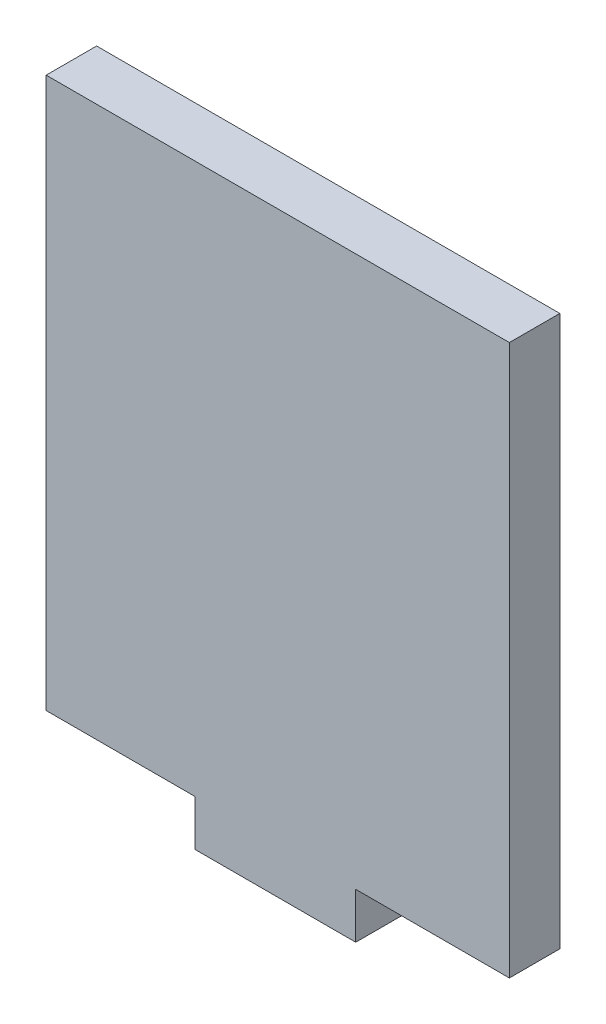
ISO-10303-21;
HEADER;
FILE_DESCRIPTION(('STEP AP214'),'2;1');
FILE_NAME('part.step','',(''),(''),'','','');
FILE_SCHEMA(('AUTOMOTIVE_DESIGN { 1 0 10303 214 1 1 1 1 }'));
ENDSEC;
DATA;
#1=APPLICATION_CONTEXT('core data for automotive mechanical design processes');
#2=APPLICATION_PROTOCOL_DEFINITION('international standard','automotive_design',2000,#1);
#3=PRODUCT_CONTEXT('',#1,'mechanical');
#4=PRODUCT('Part','Part','',(#3));
#5=PRODUCT_RELATED_PRODUCT_CATEGORY('part','',(#4));
#6=PRODUCT_DEFINITION_FORMATION('','',#4);
#7=PRODUCT_DEFINITION_CONTEXT('part definition',#1,'design');
#8=PRODUCT_DEFINITION('design','',#6,#7);
#9=PRODUCT_DEFINITION_SHAPE('','',#8);
#10=(LENGTH_UNIT() NAMED_UNIT(*) SI_UNIT(.MILLI.,.METRE.));
#11=(NAMED_UNIT(*) PLANE_ANGLE_UNIT() SI_UNIT($,.RADIAN.));
#12=(NAMED_UNIT(*) SI_UNIT($,.STERADIAN.) SOLID_ANGLE_UNIT());
#13=UNCERTAINTY_MEASURE_WITH_UNIT(LENGTH_MEASURE(1.E-05),#10,'distance_accuracy_value','');
#14=(GEOMETRIC_REPRESENTATION_CONTEXT(3) GLOBAL_UNCERTAINTY_ASSIGNED_CONTEXT((#13)) GLOBAL_UNIT_ASSIGNED_CONTEXT((#10,
#11,#12)) REPRESENTATION_CONTEXT('',''));
#15=CARTESIAN_POINT('',(0.,0.,0.));
#16=DIRECTION('',(0.,0.,1.));
#17=DIRECTION('',(1.,0.,0.));
#18=AXIS2_PLACEMENT_3D('',#15,#16,#17);
#19=CARTESIAN_POINT('',(0.,0.,0.));
#20=DIRECTION('',(0.,0.,-1.));
#21=DIRECTION('',(-1.,0.,0.));
#22=AXIS2_PLACEMENT_3D('',#19,#20,#21);
#23=PLANE('',#22);
#24=DIRECTION('',(0.,1.,0.));
#25=VECTOR('',#24,1.);
#26=CARTESIAN_POINT('',(7.63480656632229,0.,0.));
#27=LINE('',#26,#25);
#28=CARTESIAN_POINT('',(7.63480656632229,16.0005302352066,0.));
#29=VERTEX_POINT('',#28);
#30=CARTESIAN_POINT('',(7.63480656632229,35.0505302352066,0.));
#31=VERTEX_POINT('',#30);
#32=EDGE_CURVE('E11',#29,#31,#27,.T.);
#33=ORIENTED_EDGE('',*,*,#32,.F.);
#34=DIRECTION('',(-1.,0.,0.));
#35=VECTOR('',#34,1.);
#36=CARTESIAN_POINT('',(12.7148065663223,16.0005302352066,0.));
#37=LINE('',#36,#35);
#38=CARTESIAN_POINT('',(12.7148065663223,16.0005302352066,0.));
#39=VERTEX_POINT('',#38);
#40=EDGE_CURVE('E168',#39,#29,#37,.T.);
#41=ORIENTED_EDGE('',*,*,#40,.F.);
#42=DIRECTION('',(0.,1.,0.));
#43=VECTOR('',#42,1.);
#44=CARTESIAN_POINT('',(12.7148065663223,0.,0.));
#45=LINE('',#44,#43);
#46=CARTESIAN_POINT('',(12.7148065663223,35.0505302352066,0.));
#47=VERTEX_POINT('',#46);
#48=EDGE_CURVE('E41',#39,#47,#45,.T.);
#49=ORIENTED_EDGE('',*,*,#48,.T.);
#50=DIRECTION('',(-1.,0.,0.));
#51=VECTOR('',#50,1.);
#52=CARTESIAN_POINT('',(12.7148065663223,35.0505302352066,0.));
#53=LINE('',#52,#51);
#54=EDGE_CURVE('E151',#47,#31,#53,.T.);
#55=ORIENTED_EDGE('',*,*,#54,.T.);
#56=EDGE_LOOP('',(#33,#41,#49,#55));
#57=FACE_BOUND('',#56,.T.);
#58=DIRECTION('',(0.,1.,0.));
#59=VECTOR('',#58,1.);
#60=CARTESIAN_POINT('',(13.5784065663224,56.0055302352066,0.));
#61=LINE('',#60,#59);
#62=CARTESIAN_POINT('',(13.5784065663224,-4.95446976479338,0.));
#63=VERTEX_POINT('',#62);
#64=CARTESIAN_POINT('',(13.5784065663224,56.0055302352066,0.));
#65=VERTEX_POINT('',#64);
#66=EDGE_CURVE('E235',#63,#65,#61,.T.);
#67=ORIENTED_EDGE('',*,*,#66,.F.);
#68=DIRECTION('',(1.,0.,0.));
#69=VECTOR('',#68,1.);
#70=CARTESIAN_POINT('',(13.5784065663224,-4.95446976479338,0.));
#71=LINE('',#70,#69);
#72=CARTESIAN_POINT('',(-3.43959343367763,-4.95446976479338,0.));
#73=VERTEX_POINT('',#72);
#74=EDGE_CURVE('E233',#73,#63,#71,.T.);
#75=ORIENTED_EDGE('',*,*,#74,.F.);
#76=DIRECTION('',(0.,1.,0.));
#77=VECTOR('',#76,1.);
#78=CARTESIAN_POINT('',(-3.43959343367763,-4.95446976479338,0.));
#79=LINE('',#78,#77);
#80=CARTESIAN_POINT('',(-3.43959343367763,-10.0344697647934,0.));
#81=VERTEX_POINT('',#80);
#82=EDGE_CURVE('E231',#81,#73,#79,.T.);
#83=ORIENTED_EDGE('',*,*,#82,.F.);
#84=DIRECTION('',(1.,0.,0.));
#85=VECTOR('',#84,1.);
#86=CARTESIAN_POINT('',(-3.43959343367763,-10.0344697647934,0.));
#87=LINE('',#86,#85);
#88=CARTESIAN_POINT('',(-21.2195934336776,-10.0344697647934,0.));
#89=VERTEX_POINT('',#88);
#90=EDGE_CURVE('E229',#89,#81,#87,.T.);
#91=ORIENTED_EDGE('',*,*,#90,.F.);
#92=DIRECTION('',(0.,-1.,0.));
#93=VECTOR('',#92,1.);
#94=CARTESIAN_POINT('',(-21.2195934336776,-4.95446976479339,0.));
#95=LINE('',#94,#93);
#96=CARTESIAN_POINT('',(-21.2195934336776,-4.95446976479339,0.));
#97=VERTEX_POINT('',#96);
#98=EDGE_CURVE('E227',#97,#89,#95,.T.);
#99=ORIENTED_EDGE('',*,*,#98,.F.);
#100=DIRECTION('',(1.,0.,0.));
#101=VECTOR('',#100,1.);
#102=CARTESIAN_POINT('',(-21.2195934336776,-4.95446976479339,0.));
#103=LINE('',#102,#101);
#104=CARTESIAN_POINT('',(-37.7295934336776,-4.95446976479339,0.));
#105=VERTEX_POINT('',#104);
#106=EDGE_CURVE('E225',#105,#97,#103,.T.);
#107=ORIENTED_EDGE('',*,*,#106,.F.);
#108=DIRECTION('',(0.,-1.,0.));
#109=VECTOR('',#108,1.);
#110=CARTESIAN_POINT('',(-37.7295934336776,56.0055302352066,0.));
#111=LINE('',#110,#109);
#112=CARTESIAN_POINT('',(-37.7295934336772,16.0005302352066,1.2490009027033E-13));
#113=VERTEX_POINT('',#112);
#114=EDGE_CURVE('E202',#113,#105,#111,.T.);
#115=ORIENTED_EDGE('',*,*,#114,.F.);
#116=DIRECTION('',(-1.,0.,0.));
#117=VECTOR('',#116,1.);
#118=CARTESIAN_POINT('',(-32.6495934336772,16.0005302352066,-2.35922392732846E-13));
#119=LINE('',#118,#117);
#120=CARTESIAN_POINT('',(-32.6495934336768,16.0005302352066,0.));
#121=VERTEX_POINT('',#120);
#122=EDGE_CURVE('E186',#121,#113,#119,.T.);
#123=ORIENTED_EDGE('',*,*,#122,.F.);
#124=DIRECTION('',(0.,-1.,0.));
#125=VECTOR('',#124,1.);
#126=CARTESIAN_POINT('',(-32.6495934336772,0.,0.));
#127=LINE('',#126,#125);
#128=CARTESIAN_POINT('',(-32.6495934336772,35.0505302352066,-2.63677968348475E-13));
#129=VERTEX_POINT('',#128);
#130=EDGE_CURVE('E261',#129,#121,#127,.T.);
#131=ORIENTED_EDGE('',*,*,#130,.F.);
#132=DIRECTION('',(-1.,0.,0.));
#133=VECTOR('',#132,1.);
#134=CARTESIAN_POINT('',(-32.6495934336772,35.0505302352066,-2.63677968348475E-13));
#135=LINE('',#134,#133);
#136=CARTESIAN_POINT('',(-37.7295934336772,35.0505302352066,0.));
#137=VERTEX_POINT('',#136);
#138=EDGE_CURVE('E199',#129,#137,#135,.T.);
#139=ORIENTED_EDGE('',*,*,#138,.T.);
#140=CARTESIAN_POINT('',(-37.7295934336776,56.0055302352066,0.));
#141=VERTEX_POINT('',#140);
#142=EDGE_CURVE('E222',#141,#137,#111,.T.);
#143=ORIENTED_EDGE('',*,*,#142,.F.);
#144=DIRECTION('',(-1.,0.,0.));
#145=VECTOR('',#144,1.);
#146=CARTESIAN_POINT('',(-37.7295934336776,56.0055302352066,0.));
#147=LINE('',#146,#145);
#148=EDGE_CURVE('E207',#65,#141,#147,.T.);
#149=ORIENTED_EDGE('',*,*,#148,.F.);
#150=EDGE_LOOP('',(#67,#75,#83,#91,#99,#107,#115,#123,#131,#139,#143,#149));
#151=FACE_BOUND('',#150,.T.);
#152=ADVANCED_FACE('F33',(#57,#151),#23,.T.);
#153=CARTESIAN_POINT('',(-37.7295934336776,56.0055302352066,5.588));
#154=DIRECTION('',(1.,0.,0.));
#155=DIRECTION('',(0.,1.,0.));
#156=AXIS2_PLACEMENT_3D('',#153,#154,#155);
#157=PLANE('',#156);
#158=DIRECTION('',(0.,0.,1.));
#159=VECTOR('',#158,1.);
#160=CARTESIAN_POINT('',(-37.7295934336772,35.0505302352066,0.));
#161=LINE('',#160,#159);
#162=CARTESIAN_POINT('',(-37.7295934336768,35.0505302352068,5.08000000001468));
#163=VERTEX_POINT('',#162);
#164=EDGE_CURVE('E179',#137,#163,#161,.T.);
#165=ORIENTED_EDGE('',*,*,#164,.T.);
#166=DIRECTION('',(0.,-1.,0.));
#167=VECTOR('',#166,1.);
#168=CARTESIAN_POINT('',(-37.7295934336768,16.0005302352068,5.08000000001471));
#169=LINE('',#168,#167);
#170=CARTESIAN_POINT('',(-37.7295934336768,16.0005302352068,5.08000000001471));
#171=VERTEX_POINT('',#170);
#172=EDGE_CURVE('E189',#163,#171,#169,.T.);
#173=ORIENTED_EDGE('',*,*,#172,.T.);
#174=DIRECTION('',(0.,0.,-1.));
#175=VECTOR('',#174,1.);
#176=CARTESIAN_POINT('',(-37.7295934336772,16.0005302352066,1.2490009027033E-13));
#177=LINE('',#176,#175);
#178=EDGE_CURVE('E183',#171,#113,#177,.T.);
#179=ORIENTED_EDGE('',*,*,#178,.T.);
#180=ORIENTED_EDGE('',*,*,#114,.T.);
#181=DIRECTION('',(0.,0.,-1.));
#182=VECTOR('',#181,1.);
#183=CARTESIAN_POINT('',(-37.7295934336776,-4.95446976479339,5.588));
#184=LINE('',#183,#182);
#185=CARTESIAN_POINT('',(-37.7295934336776,-4.95446976479339,5.588));
#186=VERTEX_POINT('',#185);
#187=EDGE_CURVE('E258',#186,#105,#184,.T.);
#188=ORIENTED_EDGE('',*,*,#187,.F.);
#189=DIRECTION('',(0.,-1.,0.));
#190=VECTOR('',#189,1.);
#191=CARTESIAN_POINT('',(-37.7295934336776,56.0055302352066,5.588));
#192=LINE('',#191,#190);
#193=CARTESIAN_POINT('',(-37.7295934336776,56.0055302352066,5.588));
#194=VERTEX_POINT('',#193);
#195=EDGE_CURVE('E203',#194,#186,#192,.T.);
#196=ORIENTED_EDGE('',*,*,#195,.F.);
#197=DIRECTION('',(0.,0.,-1.));
#198=VECTOR('',#197,1.);
#199=CARTESIAN_POINT('',(-37.7295934336776,56.0055302352066,5.588));
#200=LINE('',#199,#198);
#201=EDGE_CURVE('E221',#194,#141,#200,.T.);
#202=ORIENTED_EDGE('',*,*,#201,.T.);
#203=ORIENTED_EDGE('',*,*,#142,.T.);
#204=EDGE_LOOP('',(#165,#173,#179,#180,#188,#196,#202,#203));
#205=FACE_BOUND('',#204,.T.);
#206=ADVANCED_FACE('F35',(#205),#157,.F.);
#207=CARTESIAN_POINT('',(-21.2195934336776,-4.95446976479339,5.588));
#208=DIRECTION('',(0.,1.,0.));
#209=DIRECTION('',(-1.,0.,0.));
#210=AXIS2_PLACEMENT_3D('',#207,#208,#209);
#211=PLANE('',#210);
#212=ORIENTED_EDGE('',*,*,#106,.T.);
#213=DIRECTION('',(0.,0.,-1.));
#214=VECTOR('',#213,1.);
#215=CARTESIAN_POINT('',(-21.2195934336776,-4.95446976479339,5.588));
#216=LINE('',#215,#214);
#217=CARTESIAN_POINT('',(-21.2195934336776,-4.95446976479339,5.588));
#218=VERTEX_POINT('',#217);
#219=EDGE_CURVE('E255',#218,#97,#216,.T.);
#220=ORIENTED_EDGE('',*,*,#219,.F.);
#221=DIRECTION('',(1.,0.,0.));
#222=VECTOR('',#221,1.);
#223=CARTESIAN_POINT('',(-21.2195934336776,-4.95446976479339,5.588));
#224=LINE('',#223,#222);
#225=EDGE_CURVE('E206',#186,#218,#224,.T.);
#226=ORIENTED_EDGE('',*,*,#225,.F.);
#227=ORIENTED_EDGE('',*,*,#187,.T.);
#228=EDGE_LOOP('',(#212,#220,#226,#227));
#229=FACE_BOUND('',#228,.T.);
#230=ADVANCED_FACE('F288',(#229),#211,.F.);
#231=CARTESIAN_POINT('',(-21.2195934336776,-4.95446976479339,5.588));
#232=DIRECTION('',(1.,0.,0.));
#233=DIRECTION('',(0.,0.,-1.));
#234=AXIS2_PLACEMENT_3D('',#231,#232,#233);
#235=PLANE('',#234);
#236=ORIENTED_EDGE('',*,*,#98,.T.);
#237=DIRECTION('',(0.,0.,-1.));
#238=VECTOR('',#237,1.);
#239=CARTESIAN_POINT('',(-21.2195934336776,-10.0344697647934,5.588));
#240=LINE('',#239,#238);
#241=CARTESIAN_POINT('',(-21.2195934336776,-10.0344697647934,5.588));
#242=VERTEX_POINT('',#241);
#243=EDGE_CURVE('E252',#242,#89,#240,.T.);
#244=ORIENTED_EDGE('',*,*,#243,.F.);
#245=DIRECTION('',(0.,-1.,0.));
#246=VECTOR('',#245,1.);
#247=CARTESIAN_POINT('',(-21.2195934336776,-4.95446976479339,5.588));
#248=LINE('',#247,#246);
#249=EDGE_CURVE('E209',#218,#242,#248,.T.);
#250=ORIENTED_EDGE('',*,*,#249,.F.);
#251=ORIENTED_EDGE('',*,*,#219,.T.);
#252=EDGE_LOOP('',(#236,#244,#250,#251));
#253=FACE_BOUND('',#252,.T.);
#254=ADVANCED_FACE('F313',(#253),#235,.F.);
#255=CARTESIAN_POINT('',(-3.43959343367763,-10.0344697647934,5.588));
#256=DIRECTION('',(0.,1.,0.));
#257=DIRECTION('',(-1.,0.,0.));
#258=AXIS2_PLACEMENT_3D('',#255,#256,#257);
#259=PLANE('',#258);
#260=ORIENTED_EDGE('',*,*,#90,.T.);
#261=DIRECTION('',(0.,0.,-1.));
#262=VECTOR('',#261,1.);
#263=CARTESIAN_POINT('',(-3.43959343367763,-10.0344697647934,5.588));
#264=LINE('',#263,#262);
#265=CARTESIAN_POINT('',(-3.43959343367763,-10.0344697647934,5.588));
#266=VERTEX_POINT('',#265);
#267=EDGE_CURVE('E249',#266,#81,#264,.T.);
#268=ORIENTED_EDGE('',*,*,#267,.F.);
#269=DIRECTION('',(1.,0.,0.));
#270=VECTOR('',#269,1.);
#271=CARTESIAN_POINT('',(-3.43959343367763,-10.0344697647934,5.588));
#272=LINE('',#271,#270);
#273=EDGE_CURVE('E211',#242,#266,#272,.T.);
#274=ORIENTED_EDGE('',*,*,#273,.F.);
#275=ORIENTED_EDGE('',*,*,#243,.T.);
#276=EDGE_LOOP('',(#260,#268,#274,#275));
#277=FACE_BOUND('',#276,.T.);
#278=ADVANCED_FACE('F309',(#277),#259,.F.);
#279=CARTESIAN_POINT('',(-3.43959343367763,-4.95446976479338,5.588));
#280=DIRECTION('',(-1.,0.,0.));
#281=DIRECTION('',(0.,-1.,0.));
#282=AXIS2_PLACEMENT_3D('',#279,#280,#281);
#283=PLANE('',#282);
#284=ORIENTED_EDGE('',*,*,#82,.T.);
#285=DIRECTION('',(0.,0.,-1.));
#286=VECTOR('',#285,1.);
#287=CARTESIAN_POINT('',(-3.43959343367763,-4.95446976479338,5.588));
#288=LINE('',#287,#286);
#289=CARTESIAN_POINT('',(-3.43959343367763,-4.95446976479338,5.588));
#290=VERTEX_POINT('',#289);
#291=EDGE_CURVE('E246',#290,#73,#288,.T.);
#292=ORIENTED_EDGE('',*,*,#291,.F.);
#293=DIRECTION('',(0.,1.,0.));
#294=VECTOR('',#293,1.);
#295=CARTESIAN_POINT('',(-3.43959343367763,-4.95446976479338,5.588));
#296=LINE('',#295,#294);
#297=EDGE_CURVE('E213',#266,#290,#296,.T.);
#298=ORIENTED_EDGE('',*,*,#297,.F.);
#299=ORIENTED_EDGE('',*,*,#267,.T.);
#300=EDGE_LOOP('',(#284,#292,#298,#299));
#301=FACE_BOUND('',#300,.T.);
#302=ADVANCED_FACE('F305',(#301),#283,.F.);
#303=CARTESIAN_POINT('',(13.5784065663224,-4.95446976479338,5.588));
#304=DIRECTION('',(0.,1.,0.));
#305=DIRECTION('',(-1.,0.,0.));
#306=AXIS2_PLACEMENT_3D('',#303,#304,#305);
#307=PLANE('',#306);
#308=ORIENTED_EDGE('',*,*,#74,.T.);
#309=DIRECTION('',(0.,0.,-1.));
#310=VECTOR('',#309,1.);
#311=CARTESIAN_POINT('',(13.5784065663224,-4.95446976479338,5.588));
#312=LINE('',#311,#310);
#313=CARTESIAN_POINT('',(13.5784065663224,-4.95446976479338,5.588));
#314=VERTEX_POINT('',#313);
#315=EDGE_CURVE('E243',#314,#63,#312,.T.);
#316=ORIENTED_EDGE('',*,*,#315,.F.);
#317=DIRECTION('',(1.,0.,0.));
#318=VECTOR('',#317,1.);
#319=CARTESIAN_POINT('',(13.5784065663224,-4.95446976479338,5.588));
#320=LINE('',#319,#318);
#321=EDGE_CURVE('E215',#290,#314,#320,.T.);
#322=ORIENTED_EDGE('',*,*,#321,.F.);
#323=ORIENTED_EDGE('',*,*,#291,.T.);
#324=EDGE_LOOP('',(#308,#316,#322,#323));
#325=FACE_BOUND('',#324,.T.);
#326=ADVANCED_FACE('F301',(#325),#307,.F.);
#327=CARTESIAN_POINT('',(13.5784065663224,56.0055302352066,5.588));
#328=DIRECTION('',(-1.,0.,0.));
#329=DIRECTION('',(0.,0.,1.));
#330=AXIS2_PLACEMENT_3D('',#327,#328,#329);
#331=PLANE('',#330);
#332=ORIENTED_EDGE('',*,*,#66,.T.);
#333=DIRECTION('',(0.,0.,-1.));
#334=VECTOR('',#333,1.);
#335=CARTESIAN_POINT('',(13.5784065663224,56.0055302352066,5.588));
#336=LINE('',#335,#334);
#337=CARTESIAN_POINT('',(13.5784065663224,56.0055302352066,5.588));
#338=VERTEX_POINT('',#337);
#339=EDGE_CURVE('E240',#338,#65,#336,.T.);
#340=ORIENTED_EDGE('',*,*,#339,.F.);
#341=DIRECTION('',(0.,1.,0.));
#342=VECTOR('',#341,1.);
#343=CARTESIAN_POINT('',(13.5784065663224,56.0055302352066,5.588));
#344=LINE('',#343,#342);
#345=EDGE_CURVE('E217',#314,#338,#344,.T.);
#346=ORIENTED_EDGE('',*,*,#345,.F.);
#347=ORIENTED_EDGE('',*,*,#315,.T.);
#348=EDGE_LOOP('',(#332,#340,#346,#347));
#349=FACE_BOUND('',#348,.T.);
#350=ADVANCED_FACE('F297',(#349),#331,.F.);
#351=CARTESIAN_POINT('',(-37.7295934336776,56.0055302352066,5.588));
#352=DIRECTION('',(0.,-1.,0.));
#353=DIRECTION('',(1.,0.,0.));
#354=AXIS2_PLACEMENT_3D('',#351,#352,#353);
#355=PLANE('',#354);
#356=ORIENTED_EDGE('',*,*,#148,.T.);
#357=ORIENTED_EDGE('',*,*,#201,.F.);
#358=DIRECTION('',(-1.,0.,0.));
#359=VECTOR('',#358,1.);
#360=CARTESIAN_POINT('',(-37.7295934336776,56.0055302352066,5.588));
#361=LINE('',#360,#359);
#362=EDGE_CURVE('E219',#338,#194,#361,.T.);
#363=ORIENTED_EDGE('',*,*,#362,.F.);
#364=ORIENTED_EDGE('',*,*,#339,.T.);
#365=EDGE_LOOP('',(#356,#357,#363,#364));
#366=FACE_BOUND('',#365,.T.);
#367=ADVANCED_FACE('F294',(#366),#355,.F.);
#368=CARTESIAN_POINT('',(0.,0.,5.588));
#369=DIRECTION('',(0.,0.,-1.));
#370=DIRECTION('',(-1.,0.,0.));
#371=AXIS2_PLACEMENT_3D('',#368,#369,#370);
#372=PLANE('',#371);
#373=ORIENTED_EDGE('',*,*,#195,.T.);
#374=ORIENTED_EDGE('',*,*,#225,.T.);
#375=ORIENTED_EDGE('',*,*,#249,.T.);
#376=ORIENTED_EDGE('',*,*,#273,.T.);
#377=ORIENTED_EDGE('',*,*,#297,.T.);
#378=ORIENTED_EDGE('',*,*,#321,.T.);
#379=ORIENTED_EDGE('',*,*,#345,.T.);
#380=ORIENTED_EDGE('',*,*,#362,.T.);
#381=EDGE_LOOP('',(#373,#374,#375,#376,#377,#378,#379,#380));
#382=FACE_BOUND('',#381,.T.);
#383=ADVANCED_FACE('F292',(#382),#372,.F.);
#384=CARTESIAN_POINT('',(-32.649593433685,-47.3538049191325,-109.219999999986));
#385=DIRECTION('',(1.,0.,0.));
#386=DIRECTION('',(0.,0.,1.));
#387=AXIS2_PLACEMENT_3D('',#384,#385,#386);
#388=PLANE('',#387);
#389=ORIENTED_EDGE('',*,*,#130,.T.);
#390=DIRECTION('',(0.,0.,-1.));
#391=VECTOR('',#390,1.);
#392=CARTESIAN_POINT('',(-32.6495934336772,16.0005302352066,-2.35922392732846E-13));
#393=LINE('',#392,#391);
#394=CARTESIAN_POINT('',(-32.6495934336768,16.0005302352068,5.08000000001435));
#395=VERTEX_POINT('',#394);
#396=EDGE_CURVE('E56',#395,#121,#393,.T.);
#397=ORIENTED_EDGE('',*,*,#396,.F.);
#398=DIRECTION('',(0.,-1.,0.));
#399=VECTOR('',#398,1.);
#400=CARTESIAN_POINT('',(-32.6495934336768,16.0005302352068,5.08000000001435));
#401=LINE('',#400,#399);
#402=CARTESIAN_POINT('',(-32.6495934336768,35.0505302352068,5.08000000001432));
#403=VERTEX_POINT('',#402);
#404=EDGE_CURVE('E182',#403,#395,#401,.T.);
#405=ORIENTED_EDGE('',*,*,#404,.F.);
#406=DIRECTION('',(0.,0.,1.));
#407=VECTOR('',#406,1.);
#408=CARTESIAN_POINT('',(-32.6495934336772,35.0505302352066,-2.63677968348475E-13));
#409=LINE('',#408,#407);
#410=EDGE_CURVE('E180',#129,#403,#409,.T.);
#411=ORIENTED_EDGE('',*,*,#410,.F.);
#412=EDGE_LOOP('',(#389,#397,#405,#411));
#413=FACE_BOUND('',#412,.T.);
#414=ADVANCED_FACE('F351',(#413),#388,.F.);
#415=CARTESIAN_POINT('',(-32.6495934336772,35.0505302352066,-2.63677968348475E-13));
#416=DIRECTION('',(0.,-1.,0.));
#417=DIRECTION('',(0.,0.,-1.));
#418=AXIS2_PLACEMENT_3D('',#415,#416,#417);
#419=PLANE('',#418);
#420=ORIENTED_EDGE('',*,*,#164,.F.);
#421=ORIENTED_EDGE('',*,*,#138,.F.);
#422=ORIENTED_EDGE('',*,*,#410,.T.);
#423=DIRECTION('',(-1.,0.,0.));
#424=VECTOR('',#423,1.);
#425=CARTESIAN_POINT('',(-32.6495934336768,35.0505302352068,5.08000000001432));
#426=LINE('',#425,#424);
#427=EDGE_CURVE('E197',#403,#163,#426,.T.);
#428=ORIENTED_EDGE('',*,*,#427,.T.);
#429=EDGE_LOOP('',(#420,#421,#422,#428));
#430=FACE_BOUND('',#429,.T.);
#431=ADVANCED_FACE('F353',(#430),#419,.T.);
#432=CARTESIAN_POINT('',(-32.6495934336768,16.0005302352068,5.08000000001435));
#433=DIRECTION('',(0.,0.,-1.));
#434=DIRECTION('',(1.,0.,0.));
#435=AXIS2_PLACEMENT_3D('',#432,#433,#434);
#436=PLANE('',#435);
#437=ORIENTED_EDGE('',*,*,#172,.F.);
#438=ORIENTED_EDGE('',*,*,#427,.F.);
#439=ORIENTED_EDGE('',*,*,#404,.T.);
#440=DIRECTION('',(-1.,0.,0.));
#441=VECTOR('',#440,1.);
#442=CARTESIAN_POINT('',(-32.6495934336768,16.0005302352068,5.08000000001435));
#443=LINE('',#442,#441);
#444=EDGE_CURVE('E195',#395,#171,#443,.T.);
#445=ORIENTED_EDGE('',*,*,#444,.T.);
#446=EDGE_LOOP('',(#437,#438,#439,#445));
#447=FACE_BOUND('',#446,.T.);
#448=ADVANCED_FACE('F279',(#447),#436,.T.);
#449=CARTESIAN_POINT('',(-32.6495934336772,16.0005302352066,-2.35922392732846E-13));
#450=DIRECTION('',(0.,1.,0.));
#451=DIRECTION('',(0.,0.,1.));
#452=AXIS2_PLACEMENT_3D('',#449,#450,#451);
#453=PLANE('',#452);
#454=ORIENTED_EDGE('',*,*,#178,.F.);
#455=ORIENTED_EDGE('',*,*,#444,.F.);
#456=ORIENTED_EDGE('',*,*,#396,.T.);
#457=ORIENTED_EDGE('',*,*,#122,.T.);
#458=EDGE_LOOP('',(#454,#455,#456,#457));
#459=FACE_BOUND('',#458,.T.);
#460=ADVANCED_FACE('F272',(#459),#453,.T.);
#461=CARTESIAN_POINT('',(7.63480656632229,42.589784454157,-9.7981399224454));
#462=DIRECTION('',(-1.,0.,0.));
#463=DIRECTION('',(0.,0.,-1.));
#464=AXIS2_PLACEMENT_3D('',#461,#462,#463);
#465=PLANE('',#464);
#466=ORIENTED_EDGE('',*,*,#32,.T.);
#467=DIRECTION('',(0.,0.,1.));
#468=VECTOR('',#467,1.);
#469=CARTESIAN_POINT('',(7.63480656632229,35.0505302352066,5.07999999999997));
#470=LINE('',#469,#468);
#471=CARTESIAN_POINT('',(7.63480656632229,35.0505302352066,5.07999999999997));
#472=VERTEX_POINT('',#471);
#473=EDGE_CURVE('E171',#31,#472,#470,.T.);
#474=ORIENTED_EDGE('',*,*,#473,.T.);
#475=DIRECTION('',(0.,-1.,0.));
#476=VECTOR('',#475,1.);
#477=CARTESIAN_POINT('',(7.63480656632229,16.0005302352066,5.07999999999997));
#478=LINE('',#477,#476);
#479=CARTESIAN_POINT('',(7.63480656632229,16.0005302352066,5.07999999999997));
#480=VERTEX_POINT('',#479);
#481=EDGE_CURVE('E160',#472,#480,#478,.T.);
#482=ORIENTED_EDGE('',*,*,#481,.T.);
#483=DIRECTION('',(0.,0.,-1.));
#484=VECTOR('',#483,1.);
#485=CARTESIAN_POINT('',(7.63480656632229,16.0005302352066,0.));
#486=LINE('',#485,#484);
#487=EDGE_CURVE('E154',#480,#29,#486,.T.);
#488=ORIENTED_EDGE('',*,*,#487,.T.);
#489=EDGE_LOOP('',(#466,#474,#482,#488));
#490=FACE_BOUND('',#489,.T.);
#491=ADVANCED_FACE('F270',(#490),#465,.F.);
#492=CARTESIAN_POINT('',(12.7148065663223,35.0505302352066,5.07999999999997));
#493=DIRECTION('',(0.,-1.,0.));
#494=DIRECTION('',(0.,0.,-1.));
#495=AXIS2_PLACEMENT_3D('',#492,#493,#494);
#496=PLANE('',#495);
#497=ORIENTED_EDGE('',*,*,#473,.F.);
#498=ORIENTED_EDGE('',*,*,#54,.F.);
#499=DIRECTION('',(0.,0.,1.));
#500=VECTOR('',#499,1.);
#501=CARTESIAN_POINT('',(12.7148065663223,35.0505302352066,5.07999999999997));
#502=LINE('',#501,#500);
#503=CARTESIAN_POINT('',(12.7148065663223,35.0505302352066,5.07999999999997));
#504=VERTEX_POINT('',#503);
#505=EDGE_CURVE('E48',#47,#504,#502,.T.);
#506=ORIENTED_EDGE('',*,*,#505,.T.);
#507=DIRECTION('',(-1.,0.,0.));
#508=VECTOR('',#507,1.);
#509=CARTESIAN_POINT('',(12.7148065663223,35.0505302352066,5.07999999999997));
#510=LINE('',#509,#508);
#511=EDGE_CURVE('E148',#504,#472,#510,.T.);
#512=ORIENTED_EDGE('',*,*,#511,.T.);
#513=EDGE_LOOP('',(#497,#498,#506,#512));
#514=FACE_BOUND('',#513,.T.);
#515=ADVANCED_FACE('F147',(#514),#496,.T.);
#516=CARTESIAN_POINT('',(12.7148065663223,16.0005302352066,5.07999999999997));
#517=DIRECTION('',(0.,0.,-1.));
#518=DIRECTION('',(1.,0.,0.));
#519=AXIS2_PLACEMENT_3D('',#516,#517,#518);
#520=PLANE('',#519);
#521=ORIENTED_EDGE('',*,*,#481,.F.);
#522=ORIENTED_EDGE('',*,*,#511,.F.);
#523=DIRECTION('',(0.,-1.,0.));
#524=VECTOR('',#523,1.);
#525=CARTESIAN_POINT('',(12.7148065663223,16.0005302352066,5.07999999999997));
#526=LINE('',#525,#524);
#527=CARTESIAN_POINT('',(12.7148065663223,16.0005302352066,5.07999999999997));
#528=VERTEX_POINT('',#527);
#529=EDGE_CURVE('E153',#504,#528,#526,.T.);
#530=ORIENTED_EDGE('',*,*,#529,.T.);
#531=DIRECTION('',(-1.,0.,0.));
#532=VECTOR('',#531,1.);
#533=CARTESIAN_POINT('',(12.7148065663223,16.0005302352066,5.07999999999997));
#534=LINE('',#533,#532);
#535=EDGE_CURVE('E161',#528,#480,#534,.T.);
#536=ORIENTED_EDGE('',*,*,#535,.T.);
#537=EDGE_LOOP('',(#521,#522,#530,#536));
#538=FACE_BOUND('',#537,.T.);
#539=ADVANCED_FACE('F157',(#538),#520,.T.);
#540=CARTESIAN_POINT('',(12.7148065663223,16.0005302352066,0.));
#541=DIRECTION('',(0.,1.,0.));
#542=DIRECTION('',(-1.,0.,0.));
#543=AXIS2_PLACEMENT_3D('',#540,#541,#542);
#544=PLANE('',#543);
#545=ORIENTED_EDGE('',*,*,#487,.F.);
#546=ORIENTED_EDGE('',*,*,#535,.F.);
#547=DIRECTION('',(0.,0.,-1.));
#548=VECTOR('',#547,1.);
#549=CARTESIAN_POINT('',(12.7148065663223,16.0005302352066,0.));
#550=LINE('',#549,#548);
#551=EDGE_CURVE('E166',#528,#39,#550,.T.);
#552=ORIENTED_EDGE('',*,*,#551,.T.);
#553=ORIENTED_EDGE('',*,*,#40,.T.);
#554=EDGE_LOOP('',(#545,#546,#552,#553));
#555=FACE_BOUND('',#554,.T.);
#556=ADVANCED_FACE('F268',(#555),#544,.T.);
#557=CARTESIAN_POINT('',(12.7148065663223,42.589784454157,-9.7981399224454));
#558=DIRECTION('',(-1.,0.,0.));
#559=DIRECTION('',(0.,0.,-1.));
#560=AXIS2_PLACEMENT_3D('',#557,#558,#559);
#561=PLANE('',#560);
#562=ORIENTED_EDGE('',*,*,#551,.F.);
#563=ORIENTED_EDGE('',*,*,#529,.F.);
#564=ORIENTED_EDGE('',*,*,#505,.F.);
#565=ORIENTED_EDGE('',*,*,#48,.F.);
#566=EDGE_LOOP('',(#562,#563,#564,#565));
#567=FACE_BOUND('',#566,.T.);
#568=ADVANCED_FACE('F164',(#567),#561,.T.);
#569=CLOSED_SHELL('',(#152,#206,#230,#254,#278,#302,#326,#350,#367,#383,#414,#431,#448,#460,
#491,#515,#539,#556,#568));
#570=MANIFOLD_SOLID_BREP('B2',#569);
#571=ADVANCED_BREP_SHAPE_REPRESENTATION('',(#18,#570),#14);
#572=SHAPE_DEFINITION_REPRESENTATION(#9,#571);
ENDSEC;
END-ISO-10303-21;
